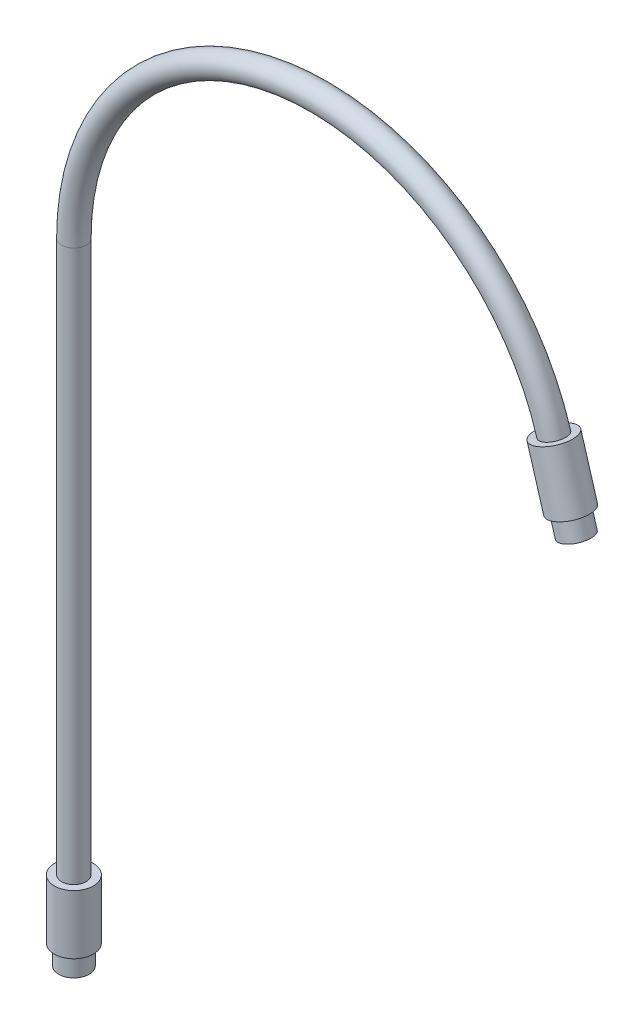
ISO-10303-21;
HEADER;
FILE_DESCRIPTION(('STEP AP214'),'2;1');
FILE_NAME('part.step','',(''),(''),'','','');
FILE_SCHEMA(('AUTOMOTIVE_DESIGN { 1 0 10303 214 1 1 1 1 }'));
ENDSEC;
DATA;
#1=APPLICATION_CONTEXT('core data for automotive mechanical design processes');
#2=APPLICATION_PROTOCOL_DEFINITION('international standard','automotive_design',2000,#1);
#3=PRODUCT_CONTEXT('',#1,'mechanical');
#4=PRODUCT('Part','Part','',(#3));
#5=PRODUCT_RELATED_PRODUCT_CATEGORY('part','',(#4));
#6=PRODUCT_DEFINITION_FORMATION('','',#4);
#7=PRODUCT_DEFINITION_CONTEXT('part definition',#1,'design');
#8=PRODUCT_DEFINITION('design','',#6,#7);
#9=PRODUCT_DEFINITION_SHAPE('','',#8);
#10=(LENGTH_UNIT() NAMED_UNIT(*) SI_UNIT(.MILLI.,.METRE.));
#11=(NAMED_UNIT(*) PLANE_ANGLE_UNIT() SI_UNIT($,.RADIAN.));
#12=(NAMED_UNIT(*) SI_UNIT($,.STERADIAN.) SOLID_ANGLE_UNIT());
#13=UNCERTAINTY_MEASURE_WITH_UNIT(LENGTH_MEASURE(1.E-05),#10,'distance_accuracy_value','');
#14=(GEOMETRIC_REPRESENTATION_CONTEXT(3) GLOBAL_UNCERTAINTY_ASSIGNED_CONTEXT((#13)) GLOBAL_UNIT_ASSIGNED_CONTEXT((#10,
#11,#12)) REPRESENTATION_CONTEXT('',''));
#15=CARTESIAN_POINT('',(0.,0.,0.));
#16=DIRECTION('',(0.,0.,1.));
#17=DIRECTION('',(1.,0.,0.));
#18=AXIS2_PLACEMENT_3D('',#15,#16,#17);
#19=CARTESIAN_POINT('',(-183.399133975534,39.9999999999999,0.));
#20=DIRECTION('',(0.,1.,0.));
#21=DIRECTION('',(0.,0.,1.));
#22=AXIS2_PLACEMENT_3D('',#19,#20,#21);
#23=CYLINDRICAL_SURFACE('',#22,3.1);
#24=CARTESIAN_POINT('',(-183.399133975534,180.,0.));
#25=DIRECTION('',(0.,-1.,0.));
#26=DIRECTION('',(1.,0.,0.));
#27=AXIS2_PLACEMENT_3D('',#24,#25,#26);
#28=CIRCLE('',#27,3.1);
#29=CARTESIAN_POINT('',(-186.499133975534,180.,0.));
#30=VERTEX_POINT('',#29);
#31=EDGE_CURVE('E47',#30,#30,#28,.T.);
#32=ORIENTED_EDGE('',*,*,#31,.T.);
#33=EDGE_LOOP('',(#32));
#34=FACE_BOUND('',#33,.T.);
#35=CARTESIAN_POINT('',(-183.399133975534,39.9999999999999,0.));
#36=DIRECTION('',(0.,-1.,0.));
#37=DIRECTION('',(1.,0.,0.));
#38=AXIS2_PLACEMENT_3D('',#35,#36,#37);
#39=CIRCLE('',#38,3.1);
#40=CARTESIAN_POINT('',(-180.299133975534,39.9999999999999,0.));
#41=VERTEX_POINT('',#40);
#42=EDGE_CURVE('E76',#41,#41,#39,.T.);
#43=ORIENTED_EDGE('',*,*,#42,.F.);
#44=EDGE_LOOP('',(#43));
#45=FACE_BOUND('',#44,.T.);
#46=ADVANCED_FACE('F43',(#34,#45),#23,.T.);
#47=CARTESIAN_POINT('',(-121.159225116177,180.,0.));
#48=DIRECTION('',(0.,0.,-1.));
#49=DIRECTION('',(-1.,0.,0.));
#50=AXIS2_PLACEMENT_3D('',#47,#48,#49);
#51=TOROIDAL_SURFACE('',#50,62.2399088593573,3.1);
#52=CARTESIAN_POINT('',(-61.492979679391,197.712860025935,0.));
#53=DIRECTION('',(0.284590070110174,-0.958649306052368,0.));
#54=DIRECTION('',(0.958649306052368,0.284590070110174,0.));
#55=AXIS2_PLACEMENT_3D('',#52,#53,#54);
#56=CIRCLE('',#55,3.1);
#57=CARTESIAN_POINT('',(-58.5211668306286,198.595089243277,0.));
#58=VERTEX_POINT('',#57);
#59=EDGE_CURVE('E63',#58,#58,#56,.T.);
#60=CARTESIAN_POINT('',(-121.159225116177,180.,0.));
#61=DIRECTION('',(0.,0.,-1.));
#62=DIRECTION('',(-1.,0.,0.));
#63=AXIS2_PLACEMENT_3D('',#60,#61,#62);
#64=CIRCLE('',#63,65.3399088593573);
#65=EDGE_CURVE('',#30,#58,#64,.T.);
#66=ORIENTED_EDGE('',*,*,#31,.F.);
#67=ORIENTED_EDGE('',*,*,#59,.F.);
#68=ORIENTED_EDGE('',*,*,#65,.T.);
#69=ORIENTED_EDGE('',*,*,#65,.F.);
#70=EDGE_LOOP('',(#66,#68,#67,#69));
#71=FACE_BOUND('',#70,.T.);
#72=ADVANCED_FACE('F45',(#71),#51,.T.);
#73=CARTESIAN_POINT('',(-183.399133975534,24.9999999999999,0.));
#74=DIRECTION('',(0.,1.,0.));
#75=DIRECTION('',(-1.,0.,0.));
#76=AXIS2_PLACEMENT_3D('',#73,#74,#75);
#77=CYLINDRICAL_SURFACE('',#76,4.95000000000002);
#78=CARTESIAN_POINT('',(-183.399133975534,24.9999999999999,0.));
#79=DIRECTION('',(0.,-1.,0.));
#80=DIRECTION('',(1.,0.,0.));
#81=AXIS2_PLACEMENT_3D('',#78,#79,#80);
#82=CIRCLE('',#81,4.95000000000002);
#83=CARTESIAN_POINT('',(-178.449133975534,24.9999999999999,0.));
#84=VERTEX_POINT('',#83);
#85=EDGE_CURVE('E73',#84,#84,#82,.T.);
#86=ORIENTED_EDGE('',*,*,#85,.F.);
#87=EDGE_LOOP('',(#86));
#88=FACE_BOUND('',#87,.T.);
#89=CARTESIAN_POINT('',(-183.399133975534,39.9999999999999,0.));
#90=DIRECTION('',(0.,-1.,0.));
#91=DIRECTION('',(1.,0.,0.));
#92=AXIS2_PLACEMENT_3D('',#89,#90,#91);
#93=CIRCLE('',#92,4.95000000000002);
#94=CARTESIAN_POINT('',(-178.449133975534,39.9999999999999,0.));
#95=VERTEX_POINT('',#94);
#96=EDGE_CURVE('E71',#95,#95,#93,.T.);
#97=ORIENTED_EDGE('',*,*,#96,.T.);
#98=EDGE_LOOP('',(#97));
#99=FACE_BOUND('',#98,.T.);
#100=ADVANCED_FACE('F87',(#88,#99),#77,.T.);
#101=CARTESIAN_POINT('',(-183.399133975534,24.9999999999999,0.));
#102=DIRECTION('',(0.,-1.,0.));
#103=DIRECTION('',(1.,0.,0.));
#104=AXIS2_PLACEMENT_3D('',#101,#102,#103);
#105=PLANE('',#104);
#106=CARTESIAN_POINT('',(-183.399133975534,24.9999999999999,0.));
#107=DIRECTION('',(0.,-1.,0.));
#108=DIRECTION('',(1.,0.,0.));
#109=AXIS2_PLACEMENT_3D('',#106,#107,#108);
#110=CIRCLE('',#109,3.85);
#111=CARTESIAN_POINT('',(-179.549133975534,24.9999999999999,0.));
#112=VERTEX_POINT('',#111);
#113=EDGE_CURVE('E51',#112,#112,#110,.T.);
#114=ORIENTED_EDGE('',*,*,#113,.F.);
#115=EDGE_LOOP('',(#114));
#116=FACE_BOUND('',#115,.T.);
#117=ORIENTED_EDGE('',*,*,#85,.T.);
#118=EDGE_LOOP('',(#117));
#119=FACE_BOUND('',#118,.T.);
#120=ADVANCED_FACE('F93',(#116,#119),#105,.T.);
#121=CARTESIAN_POINT('',(-183.399133975534,39.9999999999999,0.));
#122=DIRECTION('',(0.,-1.,0.));
#123=DIRECTION('',(1.,0.,0.));
#124=AXIS2_PLACEMENT_3D('',#121,#122,#123);
#125=PLANE('',#124);
#126=ORIENTED_EDGE('',*,*,#42,.T.);
#127=EDGE_LOOP('',(#126));
#128=FACE_BOUND('',#127,.T.);
#129=ORIENTED_EDGE('',*,*,#96,.F.);
#130=EDGE_LOOP('',(#129));
#131=FACE_BOUND('',#130,.T.);
#132=ADVANCED_FACE('F124',(#128,#131),#125,.F.);
#133=CARTESIAN_POINT('',(-183.399133975534,19.9999999999999,0.));
#134=DIRECTION('',(0.,1.,0.));
#135=DIRECTION('',(-1.,0.,0.));
#136=AXIS2_PLACEMENT_3D('',#133,#134,#135);
#137=CYLINDRICAL_SURFACE('',#136,3.85);
#138=CARTESIAN_POINT('',(-183.399133975534,19.9999999999999,0.));
#139=DIRECTION('',(0.,-1.,0.));
#140=DIRECTION('',(1.,0.,0.));
#141=AXIS2_PLACEMENT_3D('',#138,#139,#140);
#142=CIRCLE('',#141,3.85);
#143=CARTESIAN_POINT('',(-179.549133975534,19.9999999999999,0.));
#144=VERTEX_POINT('',#143);
#145=EDGE_CURVE('E69',#144,#144,#142,.T.);
#146=ORIENTED_EDGE('',*,*,#145,.F.);
#147=EDGE_LOOP('',(#146));
#148=FACE_BOUND('',#147,.T.);
#149=ORIENTED_EDGE('',*,*,#113,.T.);
#150=EDGE_LOOP('',(#149));
#151=FACE_BOUND('',#150,.T.);
#152=ADVANCED_FACE('F117',(#148,#151),#137,.T.);
#153=CARTESIAN_POINT('',(-183.399133975534,19.9999999999999,0.));
#154=DIRECTION('',(0.,-1.,0.));
#155=DIRECTION('',(1.,0.,0.));
#156=AXIS2_PLACEMENT_3D('',#153,#154,#155);
#157=PLANE('',#156);
#158=ORIENTED_EDGE('',*,*,#145,.T.);
#159=EDGE_LOOP('',(#158));
#160=FACE_BOUND('',#159,.T.);
#161=ADVANCED_FACE('F108',(#160),#157,.T.);
#162=CARTESIAN_POINT('',(-57.2241286277384,183.33312043515,0.));
#163=DIRECTION('',(-0.284590070110174,0.958649306052368,0.));
#164=DIRECTION('',(-0.958649306052368,-0.284590070110174,0.));
#165=AXIS2_PLACEMENT_3D('',#162,#163,#164);
#166=CYLINDRICAL_SURFACE('',#165,4.95000000000001);
#167=CARTESIAN_POINT('',(-57.2241286277384,183.33312043515,0.));
#168=DIRECTION('',(0.284590070110174,-0.958649306052368,0.));
#169=DIRECTION('',(0.958649306052368,0.284590070110174,0.));
#170=AXIS2_PLACEMENT_3D('',#167,#168,#169);
#171=CIRCLE('',#170,4.95000000000001);
#172=CARTESIAN_POINT('',(-61.9694426926977,181.924399588105,0.));
#173=VERTEX_POINT('',#172);
#174=EDGE_CURVE('E60',#173,#173,#171,.T.);
#175=CARTESIAN_POINT('',(-61.4929796793911,197.712860025936,0.));
#176=DIRECTION('',(0.284590070110174,-0.958649306052368,0.));
#177=DIRECTION('',(0.958649306052368,0.284590070110174,0.));
#178=AXIS2_PLACEMENT_3D('',#175,#176,#177);
#179=CIRCLE('',#178,4.95000000000001);
#180=CARTESIAN_POINT('',(-66.2382937443503,196.30413917889,0.));
#181=VERTEX_POINT('',#180);
#182=EDGE_CURVE('E64',#181,#181,#179,.T.);
#183=CARTESIAN_POINT('',(-61.9694426926977,181.924399588105,0.));
#184=CARTESIAN_POINT('',(-62.0139098911524,182.074188542175,0.));
#185=CARTESIAN_POINT('',(-62.0583770896071,182.223977496246,0.));
#186=CARTESIAN_POINT('',(-62.1473114865165,182.523555404387,0.));
#187=CARTESIAN_POINT('',(-62.1917786849712,182.673344358458,0.));
#188=CARTESIAN_POINT('',(-62.2807130818807,182.972922266599,0.));
#189=CARTESIAN_POINT('',(-62.3251802803354,183.12271122067,0.));
#190=CARTESIAN_POINT('',(-62.4141146772448,183.422289128811,0.));
#191=CARTESIAN_POINT('',(-62.4585818756995,183.572078082882,0.));
#192=CARTESIAN_POINT('',(-62.547516272609,183.871655991024,0.));
#193=CARTESIAN_POINT('',(-62.5919834710637,184.021444945094,0.));
#194=CARTESIAN_POINT('',(-62.6809178679731,184.321022853236,0.));
#195=CARTESIAN_POINT('',(-62.7253850664278,184.470811807306,0.));
#196=CARTESIAN_POINT('',(-62.8143194633372,184.770389715448,0.));
#197=CARTESIAN_POINT('',(-62.858786661792,184.920178669518,0.));
#198=CARTESIAN_POINT('',(-62.9477210587014,185.21975657766,0.));
#199=CARTESIAN_POINT('',(-62.9921882571561,185.36954553173,0.));
#200=CARTESIAN_POINT('',(-63.0811226540655,185.669123439872,0.));
#201=CARTESIAN_POINT('',(-63.1255898525202,185.818912393942,0.));
#202=CARTESIAN_POINT('',(-63.2145242494297,186.118490302084,0.));
#203=CARTESIAN_POINT('',(-63.2589914478844,186.268279256154,0.));
#204=CARTESIAN_POINT('',(-63.3479258447938,186.567857164296,0.));
#205=CARTESIAN_POINT('',(-63.3923930432485,186.717646118366,0.));
#206=CARTESIAN_POINT('',(-63.481327440158,187.017224026508,0.));
#207=CARTESIAN_POINT('',(-63.5257946386127,187.167012980579,0.));
#208=CARTESIAN_POINT('',(-63.6147290355221,187.46659088872,0.));
#209=CARTESIAN_POINT('',(-63.6591962339768,187.616379842791,0.));
#210=CARTESIAN_POINT('',(-63.7481306308863,187.915957750932,0.));
#211=CARTESIAN_POINT('',(-63.792597829341,188.065746705003,0.));
#212=CARTESIAN_POINT('',(-63.8815322262504,188.365324613144,0.));
#213=CARTESIAN_POINT('',(-63.9259994247051,188.515113567215,0.));
#214=CARTESIAN_POINT('',(-64.0149338216145,188.814691475356,0.));
#215=CARTESIAN_POINT('',(-64.0594010200693,188.964480429427,0.));
#216=CARTESIAN_POINT('',(-64.1483354169787,189.264058337568,0.));
#217=CARTESIAN_POINT('',(-64.1928026154334,189.413847291639,0.));
#218=CARTESIAN_POINT('',(-64.2817370123428,189.71342519978,0.));
#219=CARTESIAN_POINT('',(-64.3262042107976,189.863214153851,0.));
#220=CARTESIAN_POINT('',(-64.415138607707,190.162792061992,0.));
#221=CARTESIAN_POINT('',(-64.4596058061617,190.312581016063,0.));
#222=CARTESIAN_POINT('',(-64.5485402030711,190.612158924204,0.));
#223=CARTESIAN_POINT('',(-64.5930074015258,190.761947878275,0.));
#224=CARTESIAN_POINT('',(-64.6819417984353,191.061525786416,0.));
#225=CARTESIAN_POINT('',(-64.72640899689,191.211314740487,0.));
#226=CARTESIAN_POINT('',(-64.8153433937994,191.510892648628,0.));
#227=CARTESIAN_POINT('',(-64.8598105922541,191.660681602699,0.));
#228=CARTESIAN_POINT('',(-64.9487449891636,191.96025951084,0.));
#229=CARTESIAN_POINT('',(-64.9932121876183,192.110048464911,0.));
#230=CARTESIAN_POINT('',(-65.0821465845277,192.409626373052,0.));
#231=CARTESIAN_POINT('',(-65.1266137829824,192.559415327123,0.));
#232=CARTESIAN_POINT('',(-65.2155481798919,192.858993235264,0.));
#233=CARTESIAN_POINT('',(-65.2600153783466,193.008782189335,0.));
#234=CARTESIAN_POINT('',(-65.348949775256,193.308360097477,0.));
#235=CARTESIAN_POINT('',(-65.3934169737107,193.458149051547,0.));
#236=CARTESIAN_POINT('',(-65.4823513706201,193.757726959689,0.));
#237=CARTESIAN_POINT('',(-65.5268185690748,193.907515913759,0.));
#238=CARTESIAN_POINT('',(-65.6157529659843,194.207093821901,0.));
#239=CARTESIAN_POINT('',(-65.660220164439,194.356882775971,0.));
#240=CARTESIAN_POINT('',(-65.7491545613484,194.656460684113,0.));
#241=CARTESIAN_POINT('',(-65.7936217598031,194.806249638183,0.));
#242=CARTESIAN_POINT('',(-65.8825561567126,195.105827546325,0.));
#243=CARTESIAN_POINT('',(-65.9270233551673,195.255616500395,0.));
#244=CARTESIAN_POINT('',(-66.0159577520767,195.555194408537,0.));
#245=CARTESIAN_POINT('',(-66.0604249505314,195.704983362607,0.));
#246=CARTESIAN_POINT('',(-66.1493593474408,196.004561270749,0.));
#247=CARTESIAN_POINT('',(-66.1938265458956,196.154350224819,0.));
#248=CARTESIAN_POINT('',(-66.2382937443503,196.30413917889,0.));
#249=B_SPLINE_CURVE_WITH_KNOTS('',3,(#183,#184,#185,#186,#187,#188,#189,#190,#191,#192,#193,
#194,#195,#196,#197,#198,#199,#200,#201,#202,#203,#204,#205,#206,#207,#208,#209,#210,#211,#212,
#213,#214,#215,#216,#217,#218,#219,#220,#221,#222,#223,#224,#225,#226,#227,#228,#229,#230,#231,
#232,#233,#234,#235,#236,#237,#238,#239,#240,#241,#242,#243,#244,#245,#246,#247,#248),
.UNSPECIFIED.,.F.,.F.,(4,2,2,2,2,2,2,2,2,2,2,2,2,2,2,2,2,2,2,2,2,2,2,2,2,2,2,2,2,2,2,2,4),(0.,
0.468750000000011,0.937500000000022,1.40625000000001,1.87500000000001,2.34375,2.81250000000001,
3.28125000000002,3.75,4.21875000000001,4.6875,5.15625000000001,5.62500000000002,6.09375,
6.56250000000001,7.03125,7.50000000000001,7.96875000000002,8.4375,8.90625000000001,9.375,
9.84375000000001,10.3125,10.78125,11.25,11.71875,12.1875,12.65625,13.125,13.59375,14.0625,
14.53125,15.),.UNSPECIFIED.);
#250=EDGE_CURVE('BSEAM106',#173,#181,#249,.T.);
#251=ORIENTED_EDGE('',*,*,#174,.F.);
#252=ORIENTED_EDGE('',*,*,#182,.T.);
#253=ORIENTED_EDGE('',*,*,#250,.T.);
#254=ORIENTED_EDGE('',*,*,#250,.F.);
#255=EDGE_LOOP('',(#251,#253,#252,#254));
#256=FACE_BOUND('',#255,.T.);
#257=ADVANCED_FACE('F106',(#256),#166,.T.);
#258=CARTESIAN_POINT('',(-57.2241286277384,183.33312043515,0.));
#259=DIRECTION('',(0.284590070110174,-0.958649306052368,0.));
#260=DIRECTION('',(0.958649306052368,0.284590070110174,0.));
#261=AXIS2_PLACEMENT_3D('',#258,#259,#260);
#262=PLANE('',#261);
#263=CARTESIAN_POINT('',(-57.2241286277385,183.33312043515,0.));
#264=DIRECTION('',(0.284590070110174,-0.958649306052368,0.));
#265=DIRECTION('',(0.958649306052368,0.284590070110174,0.));
#266=AXIS2_PLACEMENT_3D('',#263,#264,#265);
#267=CIRCLE('',#266,3.85);
#268=CARTESIAN_POINT('',(-60.9149284560401,182.237448665226,0.));
#269=VERTEX_POINT('',#268);
#270=EDGE_CURVE('E11',#269,#269,#267,.T.);
#271=ORIENTED_EDGE('',*,*,#270,.F.);
#272=EDGE_LOOP('',(#271));
#273=FACE_BOUND('',#272,.T.);
#274=ORIENTED_EDGE('',*,*,#174,.T.);
#275=EDGE_LOOP('',(#274));
#276=FACE_BOUND('',#275,.T.);
#277=ADVANCED_FACE('F102',(#273,#276),#262,.T.);
#278=CARTESIAN_POINT('',(-61.4929796793911,197.712860025936,0.));
#279=DIRECTION('',(0.284590070110174,-0.958649306052368,0.));
#280=DIRECTION('',(0.958649306052368,0.284590070110174,0.));
#281=AXIS2_PLACEMENT_3D('',#278,#279,#280);
#282=PLANE('',#281);
#283=ORIENTED_EDGE('',*,*,#59,.T.);
#284=EDGE_LOOP('',(#283));
#285=FACE_BOUND('',#284,.T.);
#286=ORIENTED_EDGE('',*,*,#182,.F.);
#287=EDGE_LOOP('',(#286));
#288=FACE_BOUND('',#287,.T.);
#289=ADVANCED_FACE('F98',(#285,#288),#282,.F.);
#290=CARTESIAN_POINT('',(-55.8011782771876,178.539873904888,0.));
#291=DIRECTION('',(-0.284590070110174,0.958649306052368,0.));
#292=DIRECTION('',(-0.958649306052368,-0.284590070110174,0.));
#293=AXIS2_PLACEMENT_3D('',#290,#291,#292);
#294=CYLINDRICAL_SURFACE('',#293,3.85);
#295=CARTESIAN_POINT('',(-55.8011782771876,178.539873904888,0.));
#296=DIRECTION('',(0.284590070110174,-0.958649306052368,0.));
#297=DIRECTION('',(0.958649306052368,0.284590070110174,0.));
#298=AXIS2_PLACEMENT_3D('',#295,#296,#297);
#299=CIRCLE('',#298,3.85);
#300=CARTESIAN_POINT('',(-59.4919781054892,177.444202134964,0.));
#301=VERTEX_POINT('',#300);
#302=EDGE_CURVE('E59',#301,#301,#299,.T.);
#303=CARTESIAN_POINT('',(-59.4919781054892,177.444202134964,0.));
#304=CARTESIAN_POINT('',(-59.5068005049741,177.494131786321,0.));
#305=CARTESIAN_POINT('',(-59.521622904459,177.544061437678,0.));
#306=CARTESIAN_POINT('',(-59.5512677034289,177.643920740392,0.));
#307=CARTESIAN_POINT('',(-59.5660901029138,177.693850391749,0.));
#308=CARTESIAN_POINT('',(-59.5957349018836,177.793709694462,0.));
#309=CARTESIAN_POINT('',(-59.6105573013685,177.843639345819,0.));
#310=CARTESIAN_POINT('',(-59.6402021003383,177.943498648533,0.));
#311=CARTESIAN_POINT('',(-59.6550244998232,177.99342829989,0.));
#312=CARTESIAN_POINT('',(-59.684669298793,178.093287602604,0.));
#313=CARTESIAN_POINT('',(-59.6994916982779,178.143217253961,0.));
#314=CARTESIAN_POINT('',(-59.7291364972477,178.243076556674,0.));
#315=CARTESIAN_POINT('',(-59.7439588967326,178.293006208031,0.));
#316=CARTESIAN_POINT('',(-59.7736036957024,178.392865510745,0.));
#317=CARTESIAN_POINT('',(-59.7884260951873,178.442795162102,0.));
#318=CARTESIAN_POINT('',(-59.8180708941571,178.542654464816,0.));
#319=CARTESIAN_POINT('',(-59.832893293642,178.592584116173,0.));
#320=CARTESIAN_POINT('',(-59.8625380926118,178.692443418887,0.));
#321=CARTESIAN_POINT('',(-59.8773604920968,178.742373070243,0.));
#322=CARTESIAN_POINT('',(-59.9070052910666,178.842232372957,0.));
#323=CARTESIAN_POINT('',(-59.9218276905515,178.892162024314,0.));
#324=CARTESIAN_POINT('',(-59.9514724895213,178.992021327028,0.));
#325=CARTESIAN_POINT('',(-59.9662948890062,179.041950978385,0.));
#326=CARTESIAN_POINT('',(-59.995939687976,179.141810281099,0.));
#327=CARTESIAN_POINT('',(-60.0107620874609,179.191739932455,0.));
#328=CARTESIAN_POINT('',(-60.0404068864307,179.291599235169,0.));
#329=CARTESIAN_POINT('',(-60.0552292859156,179.341528886526,0.));
#330=CARTESIAN_POINT('',(-60.0848740848854,179.44138818924,0.));
#331=CARTESIAN_POINT('',(-60.0996964843703,179.491317840597,0.));
#332=CARTESIAN_POINT('',(-60.1293412833401,179.591177143311,0.));
#333=CARTESIAN_POINT('',(-60.1441636828251,179.641106794668,0.));
#334=CARTESIAN_POINT('',(-60.1738084817949,179.740966097381,0.));
#335=CARTESIAN_POINT('',(-60.1886308812798,179.790895748738,0.));
#336=CARTESIAN_POINT('',(-60.2182756802496,179.890755051452,0.));
#337=CARTESIAN_POINT('',(-60.2330980797345,179.940684702809,0.));
#338=CARTESIAN_POINT('',(-60.2627428787043,180.040544005523,0.));
#339=CARTESIAN_POINT('',(-60.2775652781892,180.09047365688,0.));
#340=CARTESIAN_POINT('',(-60.307210077159,180.190332959593,0.));
#341=CARTESIAN_POINT('',(-60.3220324766439,180.24026261095,0.));
#342=CARTESIAN_POINT('',(-60.3516772756137,180.340121913664,0.));
#343=CARTESIAN_POINT('',(-60.3664996750986,180.390051565021,0.));
#344=CARTESIAN_POINT('',(-60.3961444740684,180.489910867735,0.));
#345=CARTESIAN_POINT('',(-60.4109668735533,180.539840519092,0.));
#346=CARTESIAN_POINT('',(-60.4406116725231,180.639699821805,0.));
#347=CARTESIAN_POINT('',(-60.455434072008,180.689629473162,0.));
#348=CARTESIAN_POINT('',(-60.4850788709779,180.789488775876,0.));
#349=CARTESIAN_POINT('',(-60.4999012704628,180.839418427233,0.));
#350=CARTESIAN_POINT('',(-60.5295460694326,180.939277729947,0.));
#351=CARTESIAN_POINT('',(-60.5443684689175,180.989207381304,0.));
#352=CARTESIAN_POINT('',(-60.5740132678873,181.089066684017,0.));
#353=CARTESIAN_POINT('',(-60.5888356673722,181.138996335374,0.));
#354=CARTESIAN_POINT('',(-60.618480466342,181.238855638088,0.));
#355=CARTESIAN_POINT('',(-60.6333028658269,181.288785289445,0.));
#356=CARTESIAN_POINT('',(-60.6629476647967,181.388644592159,0.));
#357=CARTESIAN_POINT('',(-60.6777700642816,181.438574243516,0.));
#358=CARTESIAN_POINT('',(-60.7074148632514,181.538433546229,0.));
#359=CARTESIAN_POINT('',(-60.7222372627363,181.588363197586,0.));
#360=CARTESIAN_POINT('',(-60.7518820617062,181.6882225003,0.));
#361=CARTESIAN_POINT('',(-60.766704461191,181.738152151657,0.));
#362=CARTESIAN_POINT('',(-60.7963492601609,181.838011454371,0.));
#363=CARTESIAN_POINT('',(-60.8111716596458,181.887941105728,0.));
#364=CARTESIAN_POINT('',(-60.8408164586156,181.987800408442,0.));
#365=CARTESIAN_POINT('',(-60.8556388581005,182.037730059798,0.));
#366=CARTESIAN_POINT('',(-60.8852836570703,182.137589362512,0.));
#367=CARTESIAN_POINT('',(-60.9001060565552,182.187519013869,0.));
#368=CARTESIAN_POINT('',(-60.9149284560401,182.237448665226,0.));
#369=B_SPLINE_CURVE_WITH_KNOTS('',3,(#303,#304,#305,#306,#307,#308,#309,#310,#311,#312,#313,
#314,#315,#316,#317,#318,#319,#320,#321,#322,#323,#324,#325,#326,#327,#328,#329,#330,#331,#332,
#333,#334,#335,#336,#337,#338,#339,#340,#341,#342,#343,#344,#345,#346,#347,#348,#349,#350,#351,
#352,#353,#354,#355,#356,#357,#358,#359,#360,#361,#362,#363,#364,#365,#366,#367,#368),
.UNSPECIFIED.,.F.,.F.,(4,2,2,2,2,2,2,2,2,2,2,2,2,2,2,2,2,2,2,2,2,2,2,2,2,2,2,2,2,2,2,2,4),(0.,
0.156250000000011,0.312500000000024,0.468750000000009,0.625000000000022,0.781250000000009,
0.93750000000002,1.09375000000001,1.25000000000002,1.40625,1.56250000000002,1.71875,
1.87500000000001,2.03125,2.18750000000001,2.34375,2.50000000000001,2.65625000000002,
2.81250000000001,2.96875000000002,3.12500000000001,3.28125000000002,3.43750000000001,
3.59375000000002,3.75,3.90625000000002,4.0625,4.21875000000001,4.375,4.53125000000001,4.6875,
4.84375000000001,4.99999999999999),.UNSPECIFIED.);
#370=EDGE_CURVE('BSEAM101',#301,#269,#369,.T.);
#371=ORIENTED_EDGE('',*,*,#302,.F.);
#372=ORIENTED_EDGE('',*,*,#270,.T.);
#373=ORIENTED_EDGE('',*,*,#370,.T.);
#374=ORIENTED_EDGE('',*,*,#370,.F.);
#375=EDGE_LOOP('',(#371,#373,#372,#374));
#376=FACE_BOUND('',#375,.T.);
#377=ADVANCED_FACE('F101',(#376),#294,.T.);
#378=CARTESIAN_POINT('',(-55.8011782771876,178.539873904888,0.));
#379=DIRECTION('',(0.284590070110174,-0.958649306052368,0.));
#380=DIRECTION('',(0.958649306052368,0.284590070110174,0.));
#381=AXIS2_PLACEMENT_3D('',#378,#379,#380);
#382=PLANE('',#381);
#383=ORIENTED_EDGE('',*,*,#302,.T.);
#384=EDGE_LOOP('',(#383));
#385=FACE_BOUND('',#384,.T.);
#386=ADVANCED_FACE('F171',(#385),#382,.T.);
#387=CLOSED_SHELL('',(#46,#72,#100,#120,#132,#152,#161,#257,#277,#289,#377,#386));
#388=MANIFOLD_SOLID_BREP('B2',#387);
#389=ADVANCED_BREP_SHAPE_REPRESENTATION('',(#18,#388),#14);
#390=SHAPE_DEFINITION_REPRESENTATION(#9,#389);
ENDSEC;
END-ISO-10303-21;
